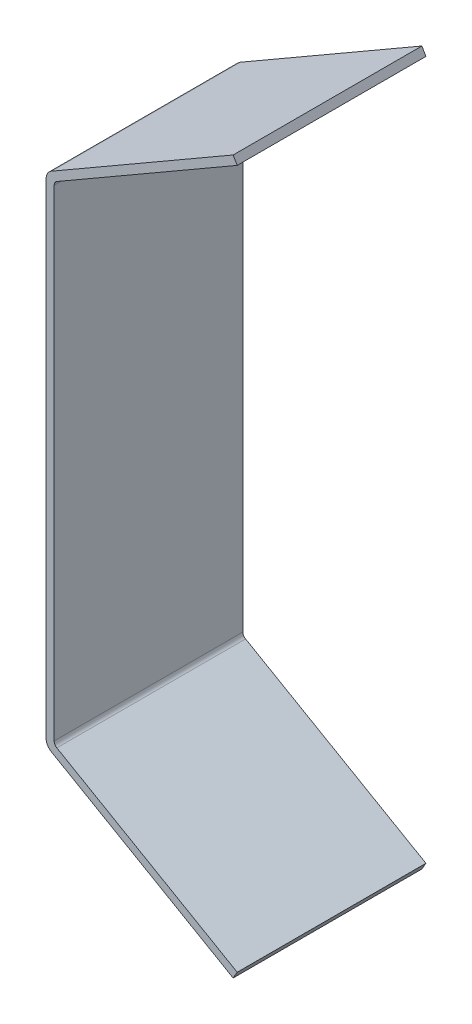
ISO-10303-21;
HEADER;
FILE_DESCRIPTION(('STEP AP214'),'2;1');
FILE_NAME('part.step','',(''),(''),'','','');
FILE_SCHEMA(('AUTOMOTIVE_DESIGN { 1 0 10303 214 1 1 1 1 }'));
ENDSEC;
DATA;
#1=APPLICATION_CONTEXT('core data for automotive mechanical design processes');
#2=APPLICATION_PROTOCOL_DEFINITION('international standard','automotive_design',2000,#1);
#3=PRODUCT_CONTEXT('',#1,'mechanical');
#4=PRODUCT('Part','Part','',(#3));
#5=PRODUCT_RELATED_PRODUCT_CATEGORY('part','',(#4));
#6=PRODUCT_DEFINITION_FORMATION('','',#4);
#7=PRODUCT_DEFINITION_CONTEXT('part definition',#1,'design');
#8=PRODUCT_DEFINITION('design','',#6,#7);
#9=PRODUCT_DEFINITION_SHAPE('','',#8);
#10=(LENGTH_UNIT() NAMED_UNIT(*) SI_UNIT(.MILLI.,.METRE.));
#11=(NAMED_UNIT(*) PLANE_ANGLE_UNIT() SI_UNIT($,.RADIAN.));
#12=(NAMED_UNIT(*) SI_UNIT($,.STERADIAN.) SOLID_ANGLE_UNIT());
#13=UNCERTAINTY_MEASURE_WITH_UNIT(LENGTH_MEASURE(1.E-05),#10,'distance_accuracy_value','');
#14=(GEOMETRIC_REPRESENTATION_CONTEXT(3) GLOBAL_UNCERTAINTY_ASSIGNED_CONTEXT((#13)) GLOBAL_UNIT_ASSIGNED_CONTEXT((#10,
#11,#12)) REPRESENTATION_CONTEXT('',''));
#15=CARTESIAN_POINT('',(0.,0.,0.));
#16=DIRECTION('',(0.,0.,1.));
#17=DIRECTION('',(1.,0.,0.));
#18=AXIS2_PLACEMENT_3D('',#15,#16,#17);
#19=CARTESIAN_POINT('',(-10.3923048454139,-6.00000000000027,70.));
#20=DIRECTION('',(0.866025403784441,0.499999999999995,0.));
#21=DIRECTION('',(-0.499999999999995,0.866025403784442,0.));
#22=AXIS2_PLACEMENT_3D('',#19,#20,#21);
#23=PLANE('',#22);
#24=DIRECTION('',(0.499999999999995,-0.866025403784442,0.));
#25=VECTOR('',#24,1.);
#26=CARTESIAN_POINT('',(-10.3923048454139,-6.00000000000027,0.));
#27=LINE('',#26,#25);
#28=CARTESIAN_POINT('',(-90.1723048454132,132.183013427845,0.));
#29=VERTEX_POINT('',#28);
#30=CARTESIAN_POINT('',(-88.6723048454132,129.584937216492,0.));
#31=VERTEX_POINT('',#30);
#32=EDGE_CURVE('E144',#29,#31,#27,.T.);
#33=ORIENTED_EDGE('',*,*,#32,.F.);
#34=DIRECTION('',(0.,0.,-1.));
#35=VECTOR('',#34,1.);
#36=CARTESIAN_POINT('',(-90.1723048454132,132.183013427845,70.));
#37=LINE('',#36,#35);
#38=CARTESIAN_POINT('',(-90.1723048454132,132.183013427845,70.));
#39=VERTEX_POINT('',#38);
#40=EDGE_CURVE('E139',#39,#29,#37,.T.);
#41=ORIENTED_EDGE('',*,*,#40,.F.);
#42=DIRECTION('',(0.499999999999995,-0.866025403784442,0.));
#43=VECTOR('',#42,1.);
#44=CARTESIAN_POINT('',(-10.3923048454139,-6.00000000000027,70.));
#45=LINE('',#44,#43);
#46=CARTESIAN_POINT('',(-88.6723048454132,129.584937216492,70.));
#47=VERTEX_POINT('',#46);
#48=EDGE_CURVE('E142',#39,#47,#45,.T.);
#49=ORIENTED_EDGE('',*,*,#48,.T.);
#50=DIRECTION('',(0.,0.,-1.));
#51=VECTOR('',#50,1.);
#52=CARTESIAN_POINT('',(-88.6723048454132,129.584937216492,70.));
#53=LINE('',#52,#51);
#54=EDGE_CURVE('E188',#47,#31,#53,.T.);
#55=ORIENTED_EDGE('',*,*,#54,.T.);
#56=EDGE_LOOP('',(#33,#41,#49,#55));
#57=FACE_BOUND('',#56,.T.);
#58=ADVANCED_FACE('F50',(#57),#23,.T.);
#59=CARTESIAN_POINT('',(-79.7800000000001,138.183013427845,70.));
#60=DIRECTION('',(0.5,-0.866025403784439,0.));
#61=DIRECTION('',(0.866025403784439,0.5,0.));
#62=AXIS2_PLACEMENT_3D('',#59,#60,#61);
#63=PLANE('',#62);
#64=DIRECTION('',(-0.866025403784439,-0.5,0.));
#65=VECTOR('',#64,1.);
#66=CARTESIAN_POINT('',(-79.7800000000001,138.183013427845,0.));
#67=LINE('',#66,#65);
#68=CARTESIAN_POINT('',(-157.56,93.2767094902761,0.));
#69=VERTEX_POINT('',#68);
#70=EDGE_CURVE('E189',#29,#69,#67,.T.);
#71=ORIENTED_EDGE('',*,*,#70,.T.);
#72=DIRECTION('',(0.,0.,-1.));
#73=VECTOR('',#72,1.);
#74=CARTESIAN_POINT('',(-157.56,93.2767094902761,70.));
#75=LINE('',#74,#73);
#76=CARTESIAN_POINT('',(-157.56,93.2767094902761,70.));
#77=VERTEX_POINT('',#76);
#78=EDGE_CURVE('E72',#69,#77,#75,.F.);
#79=ORIENTED_EDGE('',*,*,#78,.T.);
#80=DIRECTION('',(-0.866025403784439,-0.5,0.));
#81=VECTOR('',#80,1.);
#82=CARTESIAN_POINT('',(-79.7800000000001,138.183013427845,70.));
#83=LINE('',#82,#81);
#84=EDGE_CURVE('E151',#39,#77,#83,.T.);
#85=ORIENTED_EDGE('',*,*,#84,.F.);
#86=ORIENTED_EDGE('',*,*,#40,.T.);
#87=EDGE_LOOP('',(#71,#79,#85,#86));
#88=FACE_BOUND('',#87,.T.);
#89=ADVANCED_FACE('F155',(#88),#63,.F.);
#90=CARTESIAN_POINT('',(-159.56,0.,70.));
#91=DIRECTION('',(1.,0.,0.));
#92=DIRECTION('',(0.,0.,-1.));
#93=AXIS2_PLACEMENT_3D('',#90,#91,#92);
#94=PLANE('',#93);
#95=DIRECTION('',(0.,-1.,0.));
#96=VECTOR('',#95,1.);
#97=CARTESIAN_POINT('',(-159.56,0.,70.));
#98=LINE('',#97,#96);
#99=CARTESIAN_POINT('',(-159.56,89.8126078751383,70.));
#100=VERTEX_POINT('',#99);
#101=CARTESIAN_POINT('',(-159.56,-89.8126078751385,70.));
#102=VERTEX_POINT('',#101);
#103=EDGE_CURVE('E154',#100,#102,#98,.T.);
#104=ORIENTED_EDGE('',*,*,#103,.F.);
#105=DIRECTION('',(0.,0.,-1.));
#106=VECTOR('',#105,1.);
#107=CARTESIAN_POINT('',(-159.56,89.8126078751383,70.));
#108=LINE('',#107,#106);
#109=CARTESIAN_POINT('',(-159.56,89.8126078751383,0.));
#110=VERTEX_POINT('',#109);
#111=EDGE_CURVE('E246',#100,#110,#108,.T.);
#112=ORIENTED_EDGE('',*,*,#111,.T.);
#113=DIRECTION('',(0.,-1.,0.));
#114=VECTOR('',#113,1.);
#115=CARTESIAN_POINT('',(-159.56,0.,0.));
#116=LINE('',#115,#114);
#117=CARTESIAN_POINT('',(-159.56,-89.8126078751385,0.));
#118=VERTEX_POINT('',#117);
#119=EDGE_CURVE('E195',#110,#118,#116,.T.);
#120=ORIENTED_EDGE('',*,*,#119,.T.);
#121=DIRECTION('',(0.,0.,-1.));
#122=VECTOR('',#121,1.);
#123=CARTESIAN_POINT('',(-159.56,-89.8126078751385,70.));
#124=LINE('',#123,#122);
#125=EDGE_CURVE('E241',#118,#102,#124,.F.);
#126=ORIENTED_EDGE('',*,*,#125,.T.);
#127=EDGE_LOOP('',(#104,#112,#120,#126));
#128=FACE_BOUND('',#127,.T.);
#129=ADVANCED_FACE('F262',(#128),#94,.F.);
#130=CARTESIAN_POINT('',(-79.7799999999998,-138.183013427845,70.));
#131=DIRECTION('',(0.499999999999998,0.86602540378444,0.));
#132=DIRECTION('',(-0.86602540378444,0.499999999999998,0.));
#133=AXIS2_PLACEMENT_3D('',#130,#131,#132);
#134=PLANE('',#133);
#135=DIRECTION('',(0.86602540378444,-0.499999999999998,0.));
#136=VECTOR('',#135,1.);
#137=CARTESIAN_POINT('',(-79.7799999999998,-138.183013427845,70.));
#138=LINE('',#137,#136);
#139=CARTESIAN_POINT('',(-157.56,-93.2767094902763,70.));
#140=VERTEX_POINT('',#139);
#141=CARTESIAN_POINT('',(-90.1723048454132,-132.183013427845,70.));
#142=VERTEX_POINT('',#141);
#143=EDGE_CURVE('E168',#140,#142,#138,.T.);
#144=ORIENTED_EDGE('',*,*,#143,.F.);
#145=DIRECTION('',(0.,0.,-1.));
#146=VECTOR('',#145,1.);
#147=CARTESIAN_POINT('',(-157.56,-93.2767094902763,70.));
#148=LINE('',#147,#146);
#149=CARTESIAN_POINT('',(-157.56,-93.2767094902763,0.));
#150=VERTEX_POINT('',#149);
#151=EDGE_CURVE('E11',#140,#150,#148,.T.);
#152=ORIENTED_EDGE('',*,*,#151,.T.);
#153=DIRECTION('',(0.86602540378444,-0.499999999999998,0.));
#154=VECTOR('',#153,1.);
#155=CARTESIAN_POINT('',(-79.7799999999998,-138.183013427845,0.));
#156=LINE('',#155,#154);
#157=CARTESIAN_POINT('',(-90.1723048454132,-132.183013427845,0.));
#158=VERTEX_POINT('',#157);
#159=EDGE_CURVE('E198',#150,#158,#156,.T.);
#160=ORIENTED_EDGE('',*,*,#159,.T.);
#161=DIRECTION('',(0.,0.,-1.));
#162=VECTOR('',#161,1.);
#163=CARTESIAN_POINT('',(-90.1723048454132,-132.183013427845,70.));
#164=LINE('',#163,#162);
#165=EDGE_CURVE('E149',#142,#158,#164,.T.);
#166=ORIENTED_EDGE('',*,*,#165,.F.);
#167=EDGE_LOOP('',(#144,#152,#160,#166));
#168=FACE_BOUND('',#167,.T.);
#169=ADVANCED_FACE('F273',(#168),#134,.F.);
#170=CARTESIAN_POINT('',(-10.3923048454139,6.00000000000027,70.));
#171=DIRECTION('',(-0.866025403784441,0.499999999999995,0.));
#172=DIRECTION('',(-0.499999999999995,-0.866025403784442,0.));
#173=AXIS2_PLACEMENT_3D('',#170,#171,#172);
#174=PLANE('',#173);
#175=DIRECTION('',(0.499999999999995,0.866025403784442,0.));
#176=VECTOR('',#175,1.);
#177=CARTESIAN_POINT('',(-10.3923048454139,6.00000000000027,0.));
#178=LINE('',#177,#176);
#179=CARTESIAN_POINT('',(-88.6723048454132,-129.584937216492,0.));
#180=VERTEX_POINT('',#179);
#181=EDGE_CURVE('E200',#158,#180,#178,.T.);
#182=ORIENTED_EDGE('',*,*,#181,.T.);
#183=DIRECTION('',(0.,0.,-1.));
#184=VECTOR('',#183,1.);
#185=CARTESIAN_POINT('',(-88.6723048454132,-129.584937216492,70.));
#186=LINE('',#185,#184);
#187=CARTESIAN_POINT('',(-88.6723048454132,-129.584937216492,70.));
#188=VERTEX_POINT('',#187);
#189=EDGE_CURVE('E211',#188,#180,#186,.T.);
#190=ORIENTED_EDGE('',*,*,#189,.F.);
#191=DIRECTION('',(0.499999999999995,0.866025403784442,0.));
#192=VECTOR('',#191,1.);
#193=CARTESIAN_POINT('',(-10.3923048454139,6.00000000000027,70.));
#194=LINE('',#193,#192);
#195=EDGE_CURVE('E171',#142,#188,#194,.T.);
#196=ORIENTED_EDGE('',*,*,#195,.F.);
#197=ORIENTED_EDGE('',*,*,#165,.T.);
#198=EDGE_LOOP('',(#182,#190,#196,#197));
#199=FACE_BOUND('',#198,.T.);
#200=ADVANCED_FACE('F278',(#199),#174,.F.);
#201=CARTESIAN_POINT('',(-78.2799999999998,-135.584937216492,70.));
#202=DIRECTION('',(0.499999999999998,0.86602540378444,0.));
#203=DIRECTION('',(-0.86602540378444,0.499999999999998,0.));
#204=AXIS2_PLACEMENT_3D('',#201,#202,#203);
#205=PLANE('',#204);
#206=DIRECTION('',(0.86602540378444,-0.499999999999998,0.));
#207=VECTOR('',#206,1.);
#208=CARTESIAN_POINT('',(-78.2799999999998,-135.584937216492,0.));
#209=LINE('',#208,#207);
#210=CARTESIAN_POINT('',(-155.56,-90.9673084135178,0.));
#211=VERTEX_POINT('',#210);
#212=EDGE_CURVE('E201',#211,#180,#209,.T.);
#213=ORIENTED_EDGE('',*,*,#212,.F.);
#214=DIRECTION('',(0.,0.,-1.));
#215=VECTOR('',#214,1.);
#216=CARTESIAN_POINT('',(-155.56,-90.9673084135178,70.));
#217=LINE('',#216,#215);
#218=CARTESIAN_POINT('',(-155.56,-90.9673084135178,70.));
#219=VERTEX_POINT('',#218);
#220=EDGE_CURVE('E226',#211,#219,#217,.F.);
#221=ORIENTED_EDGE('',*,*,#220,.T.);
#222=DIRECTION('',(0.86602540378444,-0.499999999999998,0.));
#223=VECTOR('',#222,1.);
#224=CARTESIAN_POINT('',(-78.2799999999998,-135.584937216492,70.));
#225=LINE('',#224,#223);
#226=EDGE_CURVE('E180',#219,#188,#225,.T.);
#227=ORIENTED_EDGE('',*,*,#226,.T.);
#228=ORIENTED_EDGE('',*,*,#189,.T.);
#229=EDGE_LOOP('',(#213,#221,#227,#228));
#230=FACE_BOUND('',#229,.T.);
#231=ADVANCED_FACE('F310',(#230),#205,.T.);
#232=CARTESIAN_POINT('',(-156.56,0.,70.));
#233=DIRECTION('',(1.,0.,0.));
#234=DIRECTION('',(0.,0.,-1.));
#235=AXIS2_PLACEMENT_3D('',#232,#233,#234);
#236=PLANE('',#235);
#237=DIRECTION('',(0.,-1.,0.));
#238=VECTOR('',#237,1.);
#239=CARTESIAN_POINT('',(-156.56,0.,0.));
#240=LINE('',#239,#238);
#241=CARTESIAN_POINT('',(-156.56,89.2352576059487,0.));
#242=VERTEX_POINT('',#241);
#243=CARTESIAN_POINT('',(-156.56,-89.2352576059489,0.));
#244=VERTEX_POINT('',#243);
#245=EDGE_CURVE('E164',#242,#244,#240,.T.);
#246=ORIENTED_EDGE('',*,*,#245,.F.);
#247=DIRECTION('',(0.,0.,-1.));
#248=VECTOR('',#247,1.);
#249=CARTESIAN_POINT('',(-156.56,89.2352576059487,70.));
#250=LINE('',#249,#248);
#251=CARTESIAN_POINT('',(-156.56,89.2352576059487,70.));
#252=VERTEX_POINT('',#251);
#253=EDGE_CURVE('E223',#242,#252,#250,.F.);
#254=ORIENTED_EDGE('',*,*,#253,.T.);
#255=DIRECTION('',(0.,-1.,0.));
#256=VECTOR('',#255,1.);
#257=CARTESIAN_POINT('',(-156.56,0.,70.));
#258=LINE('',#257,#256);
#259=CARTESIAN_POINT('',(-156.56,-89.2352576059489,70.));
#260=VERTEX_POINT('',#259);
#261=EDGE_CURVE('E179',#252,#260,#258,.T.);
#262=ORIENTED_EDGE('',*,*,#261,.T.);
#263=DIRECTION('',(0.,0.,-1.));
#264=VECTOR('',#263,1.);
#265=CARTESIAN_POINT('',(-156.56,-89.2352576059489,0.));
#266=LINE('',#265,#264);
#267=EDGE_CURVE('E222',#260,#244,#266,.T.);
#268=ORIENTED_EDGE('',*,*,#267,.T.);
#269=EDGE_LOOP('',(#246,#254,#262,#268));
#270=FACE_BOUND('',#269,.T.);
#271=ADVANCED_FACE('F295',(#270),#236,.T.);
#272=CARTESIAN_POINT('',(-78.2800000000001,135.584937216492,70.));
#273=DIRECTION('',(0.5,-0.866025403784439,0.));
#274=DIRECTION('',(0.866025403784439,0.5,0.));
#275=AXIS2_PLACEMENT_3D('',#272,#273,#274);
#276=PLANE('',#275);
#277=DIRECTION('',(-0.866025403784439,-0.5,0.));
#278=VECTOR('',#277,1.);
#279=CARTESIAN_POINT('',(-78.2800000000001,135.584937216492,70.));
#280=LINE('',#279,#278);
#281=CARTESIAN_POINT('',(-155.56,90.9673084135176,70.));
#282=VERTEX_POINT('',#281);
#283=EDGE_CURVE('E157',#47,#282,#280,.T.);
#284=ORIENTED_EDGE('',*,*,#283,.T.);
#285=DIRECTION('',(0.,0.,-1.));
#286=VECTOR('',#285,1.);
#287=CARTESIAN_POINT('',(-155.56,90.9673084135176,0.));
#288=LINE('',#287,#286);
#289=CARTESIAN_POINT('',(-155.56,90.9673084135176,0.));
#290=VERTEX_POINT('',#289);
#291=EDGE_CURVE('E146',#282,#290,#288,.T.);
#292=ORIENTED_EDGE('',*,*,#291,.T.);
#293=DIRECTION('',(-0.866025403784439,-0.5,0.));
#294=VECTOR('',#293,1.);
#295=CARTESIAN_POINT('',(-78.2800000000001,135.584937216492,0.));
#296=LINE('',#295,#294);
#297=EDGE_CURVE('E161',#31,#290,#296,.T.);
#298=ORIENTED_EDGE('',*,*,#297,.F.);
#299=ORIENTED_EDGE('',*,*,#54,.F.);
#300=EDGE_LOOP('',(#284,#292,#298,#299));
#301=FACE_BOUND('',#300,.T.);
#302=ADVANCED_FACE('F297',(#301),#276,.T.);
#303=CARTESIAN_POINT('',(0.,0.,70.));
#304=DIRECTION('',(0.,0.,1.));
#305=DIRECTION('',(1.,0.,0.));
#306=AXIS2_PLACEMENT_3D('',#303,#304,#305);
#307=PLANE('',#306);
#308=ORIENTED_EDGE('',*,*,#84,.T.);
#309=CARTESIAN_POINT('',(-155.56,89.8126078751383,70.));
#310=DIRECTION('',(0.,0.,1.));
#311=DIRECTION('',(1.,0.,0.));
#312=AXIS2_PLACEMENT_3D('',#309,#310,#311);
#313=CIRCLE('',#312,4.);
#314=EDGE_CURVE('E57',#77,#100,#313,.T.);
#315=ORIENTED_EDGE('',*,*,#314,.T.);
#316=ORIENTED_EDGE('',*,*,#103,.T.);
#317=CARTESIAN_POINT('',(-155.56,-89.8126078751385,70.));
#318=DIRECTION('',(0.,0.,1.));
#319=DIRECTION('',(1.,0.,0.));
#320=AXIS2_PLACEMENT_3D('',#317,#318,#319);
#321=CIRCLE('',#320,4.);
#322=EDGE_CURVE('E61',#102,#140,#321,.T.);
#323=ORIENTED_EDGE('',*,*,#322,.T.);
#324=ORIENTED_EDGE('',*,*,#143,.T.);
#325=ORIENTED_EDGE('',*,*,#195,.T.);
#326=ORIENTED_EDGE('',*,*,#226,.F.);
#327=CARTESIAN_POINT('',(-154.56,-89.2352576059489,70.));
#328=DIRECTION('',(0.,0.,1.));
#329=DIRECTION('',(1.,0.,0.));
#330=AXIS2_PLACEMENT_3D('',#327,#328,#329);
#331=CIRCLE('',#330,2.);
#332=EDGE_CURVE('E238',#219,#260,#331,.F.);
#333=ORIENTED_EDGE('',*,*,#332,.T.);
#334=ORIENTED_EDGE('',*,*,#261,.F.);
#335=CARTESIAN_POINT('',(-154.56,89.2352576059487,70.));
#336=DIRECTION('',(0.,0.,1.));
#337=DIRECTION('',(1.,0.,0.));
#338=AXIS2_PLACEMENT_3D('',#335,#336,#337);
#339=CIRCLE('',#338,2.);
#340=EDGE_CURVE('E233',#252,#282,#339,.F.);
#341=ORIENTED_EDGE('',*,*,#340,.T.);
#342=ORIENTED_EDGE('',*,*,#283,.F.);
#343=ORIENTED_EDGE('',*,*,#48,.F.);
#344=EDGE_LOOP('',(#308,#315,#316,#323,#324,#325,#326,#333,#334,#341,#342,#343));
#345=FACE_BOUND('',#344,.T.);
#346=ADVANCED_FACE('F160',(#345),#307,.T.);
#347=CARTESIAN_POINT('',(0.,0.,0.));
#348=DIRECTION('',(0.,0.,1.));
#349=DIRECTION('',(1.,0.,0.));
#350=AXIS2_PLACEMENT_3D('',#347,#348,#349);
#351=PLANE('',#350);
#352=ORIENTED_EDGE('',*,*,#119,.F.);
#353=CARTESIAN_POINT('',(-155.56,89.8126078751383,0.));
#354=DIRECTION('',(0.,0.,1.));
#355=DIRECTION('',(1.,0.,0.));
#356=AXIS2_PLACEMENT_3D('',#353,#354,#355);
#357=CIRCLE('',#356,4.);
#358=EDGE_CURVE('E251',#110,#69,#357,.F.);
#359=ORIENTED_EDGE('',*,*,#358,.T.);
#360=ORIENTED_EDGE('',*,*,#70,.F.);
#361=ORIENTED_EDGE('',*,*,#32,.T.);
#362=ORIENTED_EDGE('',*,*,#297,.T.);
#363=CARTESIAN_POINT('',(-154.56,89.2352576059487,0.));
#364=DIRECTION('',(0.,0.,1.));
#365=DIRECTION('',(1.,0.,0.));
#366=AXIS2_PLACEMENT_3D('',#363,#364,#365);
#367=CIRCLE('',#366,2.);
#368=EDGE_CURVE('E231',#290,#242,#367,.T.);
#369=ORIENTED_EDGE('',*,*,#368,.T.);
#370=ORIENTED_EDGE('',*,*,#245,.T.);
#371=CARTESIAN_POINT('',(-154.56,-89.2352576059489,0.));
#372=DIRECTION('',(0.,0.,1.));
#373=DIRECTION('',(1.,0.,0.));
#374=AXIS2_PLACEMENT_3D('',#371,#372,#373);
#375=CIRCLE('',#374,2.);
#376=EDGE_CURVE('E240',#244,#211,#375,.T.);
#377=ORIENTED_EDGE('',*,*,#376,.T.);
#378=ORIENTED_EDGE('',*,*,#212,.T.);
#379=ORIENTED_EDGE('',*,*,#181,.F.);
#380=ORIENTED_EDGE('',*,*,#159,.F.);
#381=CARTESIAN_POINT('',(-155.56,-89.8126078751385,0.));
#382=DIRECTION('',(0.,0.,1.));
#383=DIRECTION('',(1.,0.,0.));
#384=AXIS2_PLACEMENT_3D('',#381,#382,#383);
#385=CIRCLE('',#384,4.);
#386=EDGE_CURVE('E249',#150,#118,#385,.F.);
#387=ORIENTED_EDGE('',*,*,#386,.T.);
#388=EDGE_LOOP('',(#352,#359,#360,#361,#362,#369,#370,#377,#378,#379,#380,#387));
#389=FACE_BOUND('',#388,.T.);
#390=ADVANCED_FACE('F267',(#389),#351,.F.);
#391=CARTESIAN_POINT('',(-154.56,89.2352576059487,70.));
#392=DIRECTION('',(0.,0.,1.));
#393=DIRECTION('',(1.,0.,0.));
#394=AXIS2_PLACEMENT_3D('',#391,#392,#393);
#395=CYLINDRICAL_SURFACE('',#394,2.);
#396=ORIENTED_EDGE('',*,*,#340,.F.);
#397=ORIENTED_EDGE('',*,*,#253,.F.);
#398=ORIENTED_EDGE('',*,*,#368,.F.);
#399=ORIENTED_EDGE('',*,*,#291,.F.);
#400=EDGE_LOOP('',(#396,#397,#398,#399));
#401=FACE_BOUND('',#400,.T.);
#402=ADVANCED_FACE('F296',(#401),#395,.F.);
#403=CARTESIAN_POINT('',(-154.56,-89.2352576059489,70.));
#404=DIRECTION('',(0.,0.,1.));
#405=DIRECTION('',(1.,0.,0.));
#406=AXIS2_PLACEMENT_3D('',#403,#404,#405);
#407=CYLINDRICAL_SURFACE('',#406,2.);
#408=ORIENTED_EDGE('',*,*,#332,.F.);
#409=ORIENTED_EDGE('',*,*,#220,.F.);
#410=ORIENTED_EDGE('',*,*,#376,.F.);
#411=ORIENTED_EDGE('',*,*,#267,.F.);
#412=EDGE_LOOP('',(#408,#409,#410,#411));
#413=FACE_BOUND('',#412,.T.);
#414=ADVANCED_FACE('F288',(#413),#407,.F.);
#415=CARTESIAN_POINT('',(-155.56,89.8126078751383,70.));
#416=DIRECTION('',(0.,0.,-1.));
#417=DIRECTION('',(-1.,0.,0.));
#418=AXIS2_PLACEMENT_3D('',#415,#416,#417);
#419=CYLINDRICAL_SURFACE('',#418,4.);
#420=ORIENTED_EDGE('',*,*,#314,.F.);
#421=ORIENTED_EDGE('',*,*,#78,.F.);
#422=ORIENTED_EDGE('',*,*,#358,.F.);
#423=ORIENTED_EDGE('',*,*,#111,.F.);
#424=EDGE_LOOP('',(#420,#421,#422,#423));
#425=FACE_BOUND('',#424,.T.);
#426=ADVANCED_FACE('F270',(#425),#419,.T.);
#427=CARTESIAN_POINT('',(-155.56,-89.8126078751385,70.));
#428=DIRECTION('',(0.,0.,-1.));
#429=DIRECTION('',(-1.,0.,0.));
#430=AXIS2_PLACEMENT_3D('',#427,#428,#429);
#431=CYLINDRICAL_SURFACE('',#430,4.);
#432=ORIENTED_EDGE('',*,*,#322,.F.);
#433=ORIENTED_EDGE('',*,*,#125,.F.);
#434=ORIENTED_EDGE('',*,*,#386,.F.);
#435=ORIENTED_EDGE('',*,*,#151,.F.);
#436=EDGE_LOOP('',(#432,#433,#434,#435));
#437=FACE_BOUND('',#436,.T.);
#438=ADVANCED_FACE('F47',(#437),#431,.T.);
#439=CLOSED_SHELL('',(#58,#89,#129,#169,#200,#231,#271,#302,#346,#390,#402,#414,#426,#438));
#440=MANIFOLD_SOLID_BREP('B2',#439);
#441=ADVANCED_BREP_SHAPE_REPRESENTATION('',(#18,#440),#14);
#442=SHAPE_DEFINITION_REPRESENTATION(#9,#441);
ENDSEC;
END-ISO-10303-21;
